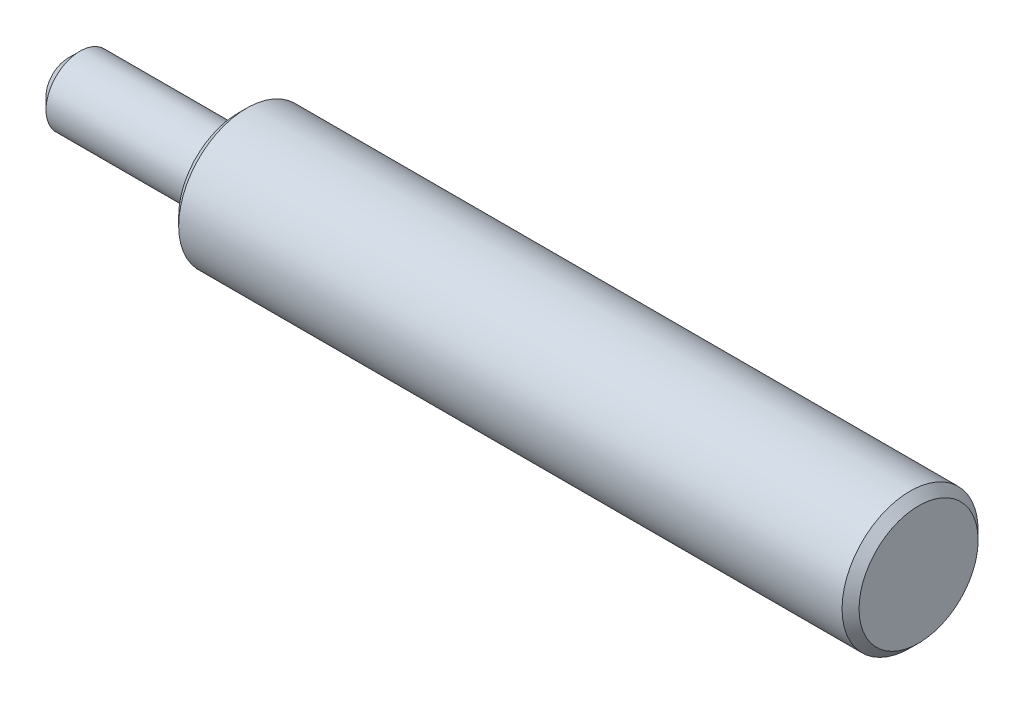
ISO-10303-21;
HEADER;
FILE_DESCRIPTION(('STEP AP214'),'2;1');
FILE_NAME('part.step','',(''),(''),'','','');
FILE_SCHEMA(('AUTOMOTIVE_DESIGN { 1 0 10303 214 1 1 1 1 }'));
ENDSEC;
DATA;
#1=APPLICATION_CONTEXT('core data for automotive mechanical design processes');
#2=APPLICATION_PROTOCOL_DEFINITION('international standard','automotive_design',2000,#1);
#3=PRODUCT_CONTEXT('',#1,'mechanical');
#4=PRODUCT('Part','Part','',(#3));
#5=PRODUCT_RELATED_PRODUCT_CATEGORY('part','',(#4));
#6=PRODUCT_DEFINITION_FORMATION('','',#4);
#7=PRODUCT_DEFINITION_CONTEXT('part definition',#1,'design');
#8=PRODUCT_DEFINITION('design','',#6,#7);
#9=PRODUCT_DEFINITION_SHAPE('','',#8);
#10=(LENGTH_UNIT() NAMED_UNIT(*) SI_UNIT(.MILLI.,.METRE.));
#11=(NAMED_UNIT(*) PLANE_ANGLE_UNIT() SI_UNIT($,.RADIAN.));
#12=(NAMED_UNIT(*) SI_UNIT($,.STERADIAN.) SOLID_ANGLE_UNIT());
#13=UNCERTAINTY_MEASURE_WITH_UNIT(LENGTH_MEASURE(1.E-05),#10,'distance_accuracy_value','');
#14=(GEOMETRIC_REPRESENTATION_CONTEXT(3) GLOBAL_UNCERTAINTY_ASSIGNED_CONTEXT((#13)) GLOBAL_UNIT_ASSIGNED_CONTEXT((#10,
#11,#12)) REPRESENTATION_CONTEXT('',''));
#15=CARTESIAN_POINT('',(0.,0.,0.));
#16=DIRECTION('',(0.,0.,1.));
#17=DIRECTION('',(1.,0.,0.));
#18=AXIS2_PLACEMENT_3D('',#15,#16,#17);
#19=CARTESIAN_POINT('',(40.,3.5,0.));
#20=DIRECTION('',(-1.,0.,0.));
#21=DIRECTION('',(0.,0.,1.));
#22=AXIS2_PLACEMENT_3D('',#19,#20,#21);
#23=PLANE('',#22);
#24=CARTESIAN_POINT('',(40.,0.,0.));
#25=DIRECTION('',(-1.,0.,0.));
#26=DIRECTION('',(0.,0.,1.));
#27=AXIS2_PLACEMENT_3D('',#24,#25,#26);
#28=CIRCLE('',#27,3.5);
#29=CARTESIAN_POINT('',(40.,0.,3.5));
#30=VERTEX_POINT('',#29);
#31=EDGE_CURVE('E10',#30,#30,#28,.T.);
#32=ORIENTED_EDGE('',*,*,#31,.F.);
#33=EDGE_LOOP('',(#32));
#34=FACE_BOUND('',#33,.T.);
#35=ADVANCED_FACE('F33',(#34),#23,.F.);
#36=CARTESIAN_POINT('',(40.,0.,0.));
#37=DIRECTION('',(-1.,0.,0.));
#38=DIRECTION('',(0.,0.,1.));
#39=AXIS2_PLACEMENT_3D('',#36,#37,#38);
#40=CONICAL_SURFACE('',#39,3.5,0.785398163397448);
#41=CARTESIAN_POINT('',(39.5,0.,0.));
#42=DIRECTION('',(-1.,0.,0.));
#43=DIRECTION('',(0.,0.,1.));
#44=AXIS2_PLACEMENT_3D('',#41,#42,#43);
#45=CIRCLE('',#44,4.);
#46=CARTESIAN_POINT('',(39.5,0.,4.));
#47=VERTEX_POINT('',#46);
#48=EDGE_CURVE('E39',#47,#47,#45,.T.);
#49=ORIENTED_EDGE('',*,*,#48,.F.);
#50=EDGE_LOOP('',(#49));
#51=FACE_BOUND('',#50,.T.);
#52=ORIENTED_EDGE('',*,*,#31,.T.);
#53=EDGE_LOOP('',(#52));
#54=FACE_BOUND('',#53,.T.);
#55=ADVANCED_FACE('F99',(#51,#54),#40,.T.);
#56=CARTESIAN_POINT('',(40.,0.,0.));
#57=DIRECTION('',(-1.,0.,0.));
#58=DIRECTION('',(0.,0.,1.));
#59=AXIS2_PLACEMENT_3D('',#56,#57,#58);
#60=CYLINDRICAL_SURFACE('',#59,4.);
#61=CARTESIAN_POINT('',(0.5,0.,0.));
#62=DIRECTION('',(-1.,0.,0.));
#63=DIRECTION('',(0.,0.,1.));
#64=AXIS2_PLACEMENT_3D('',#61,#62,#63);
#65=CIRCLE('',#64,4.);
#66=CARTESIAN_POINT('',(0.5,0.,4.));
#67=VERTEX_POINT('',#66);
#68=EDGE_CURVE('E43',#67,#67,#65,.T.);
#69=ORIENTED_EDGE('',*,*,#68,.F.);
#70=EDGE_LOOP('',(#69));
#71=FACE_BOUND('',#70,.T.);
#72=ORIENTED_EDGE('',*,*,#48,.T.);
#73=EDGE_LOOP('',(#72));
#74=FACE_BOUND('',#73,.T.);
#75=ADVANCED_FACE('F94',(#71,#74),#60,.T.);
#76=CARTESIAN_POINT('',(0.5,0.,0.));
#77=DIRECTION('',(1.,0.,0.));
#78=DIRECTION('',(0.,0.,-1.));
#79=AXIS2_PLACEMENT_3D('',#76,#77,#78);
#80=CONICAL_SURFACE('',#79,4.,0.785398163397448);
#81=CARTESIAN_POINT('',(0.,0.,0.));
#82=DIRECTION('',(-1.,0.,0.));
#83=DIRECTION('',(0.,0.,1.));
#84=AXIS2_PLACEMENT_3D('',#81,#82,#83);
#85=CIRCLE('',#84,3.5);
#86=CARTESIAN_POINT('',(0.,0.,3.5));
#87=VERTEX_POINT('',#86);
#88=EDGE_CURVE('E47',#87,#87,#85,.T.);
#89=ORIENTED_EDGE('',*,*,#88,.F.);
#90=EDGE_LOOP('',(#89));
#91=FACE_BOUND('',#90,.T.);
#92=ORIENTED_EDGE('',*,*,#68,.T.);
#93=EDGE_LOOP('',(#92));
#94=FACE_BOUND('',#93,.T.);
#95=ADVANCED_FACE('F88',(#91,#94),#80,.T.);
#96=CARTESIAN_POINT('',(0.,2.3,0.));
#97=DIRECTION('',(1.,0.,0.));
#98=DIRECTION('',(0.,0.,-1.));
#99=AXIS2_PLACEMENT_3D('',#96,#97,#98);
#100=PLANE('',#99);
#101=CARTESIAN_POINT('',(0.,0.,0.));
#102=DIRECTION('',(-1.,0.,0.));
#103=DIRECTION('',(0.,0.,1.));
#104=AXIS2_PLACEMENT_3D('',#101,#102,#103);
#105=CIRCLE('',#104,2.3);
#106=CARTESIAN_POINT('',(0.,0.,2.3));
#107=VERTEX_POINT('',#106);
#108=EDGE_CURVE('E52',#107,#107,#105,.T.);
#109=ORIENTED_EDGE('',*,*,#108,.F.);
#110=EDGE_LOOP('',(#109));
#111=FACE_BOUND('',#110,.T.);
#112=ORIENTED_EDGE('',*,*,#88,.T.);
#113=EDGE_LOOP('',(#112));
#114=FACE_BOUND('',#113,.T.);
#115=ADVANCED_FACE('F82',(#111,#114),#100,.F.);
#116=CARTESIAN_POINT('',(-0.299999999999939,0.,0.));
#117=DIRECTION('',(-1.,0.,0.));
#118=DIRECTION('',(0.,0.,1.));
#119=AXIS2_PLACEMENT_3D('',#116,#117,#118);
#120=TOROIDAL_SURFACE('',#119,2.29999999999994,0.299999999999939);
#121=CARTESIAN_POINT('',(-0.300000000000002,0.,0.));
#122=DIRECTION('',(-1.,0.,0.));
#123=DIRECTION('',(0.,0.,1.));
#124=AXIS2_PLACEMENT_3D('',#121,#122,#123);
#125=CIRCLE('',#124,2.);
#126=CARTESIAN_POINT('',(-0.300000000000002,0.,2.));
#127=VERTEX_POINT('',#126);
#128=EDGE_CURVE('E55',#127,#127,#125,.T.);
#129=ORIENTED_EDGE('',*,*,#128,.F.);
#130=EDGE_LOOP('',(#129));
#131=FACE_BOUND('',#130,.T.);
#132=ORIENTED_EDGE('',*,*,#108,.T.);
#133=EDGE_LOOP('',(#132));
#134=FACE_BOUND('',#133,.T.);
#135=ADVANCED_FACE('F76',(#131,#134),#120,.F.);
#136=CARTESIAN_POINT('',(40.,0.,0.));
#137=DIRECTION('',(-1.,0.,0.));
#138=DIRECTION('',(0.,0.,1.));
#139=AXIS2_PLACEMENT_3D('',#136,#137,#138);
#140=CYLINDRICAL_SURFACE('',#139,2.);
#141=CARTESIAN_POINT('',(-9.3,0.,0.));
#142=DIRECTION('',(-1.,0.,0.));
#143=DIRECTION('',(0.,0.,1.));
#144=AXIS2_PLACEMENT_3D('',#141,#142,#143);
#145=CIRCLE('',#144,2.);
#146=CARTESIAN_POINT('',(-9.3,0.,2.));
#147=VERTEX_POINT('',#146);
#148=EDGE_CURVE('E58',#147,#147,#145,.T.);
#149=ORIENTED_EDGE('',*,*,#148,.F.);
#150=EDGE_LOOP('',(#149));
#151=FACE_BOUND('',#150,.T.);
#152=ORIENTED_EDGE('',*,*,#128,.T.);
#153=EDGE_LOOP('',(#152));
#154=FACE_BOUND('',#153,.T.);
#155=ADVANCED_FACE('F70',(#151,#154),#140,.T.);
#156=CARTESIAN_POINT('',(-9.3,0.,0.));
#157=DIRECTION('',(1.,0.,0.));
#158=DIRECTION('',(0.,0.,-1.));
#159=AXIS2_PLACEMENT_3D('',#156,#157,#158);
#160=CONICAL_SURFACE('',#159,2.,0.785398163397444);
#161=CARTESIAN_POINT('',(-10.,0.,0.));
#162=DIRECTION('',(-1.,0.,0.));
#163=DIRECTION('',(0.,0.,1.));
#164=AXIS2_PLACEMENT_3D('',#161,#162,#163);
#165=CIRCLE('',#164,1.3);
#166=CARTESIAN_POINT('',(-10.,0.,1.3));
#167=VERTEX_POINT('',#166);
#168=EDGE_CURVE('E61',#167,#167,#165,.T.);
#169=ORIENTED_EDGE('',*,*,#168,.F.);
#170=EDGE_LOOP('',(#169));
#171=FACE_BOUND('',#170,.T.);
#172=ORIENTED_EDGE('',*,*,#148,.T.);
#173=EDGE_LOOP('',(#172));
#174=FACE_BOUND('',#173,.T.);
#175=ADVANCED_FACE('F67',(#171,#174),#160,.T.);
#176=CARTESIAN_POINT('',(-10.,0.,0.));
#177=DIRECTION('',(1.,0.,0.));
#178=DIRECTION('',(0.,0.,-1.));
#179=AXIS2_PLACEMENT_3D('',#176,#177,#178);
#180=PLANE('',#179);
#181=ORIENTED_EDGE('',*,*,#168,.T.);
#182=EDGE_LOOP('',(#181));
#183=FACE_BOUND('',#182,.T.);
#184=ADVANCED_FACE('F65',(#183),#180,.F.);
#185=CLOSED_SHELL('',(#35,#55,#75,#95,#115,#135,#155,#175,#184));
#186=MANIFOLD_SOLID_BREP('B2',#185);
#187=ADVANCED_BREP_SHAPE_REPRESENTATION('',(#18,#186),#14);
#188=SHAPE_DEFINITION_REPRESENTATION(#9,#187);
ENDSEC;
END-ISO-10303-21;
